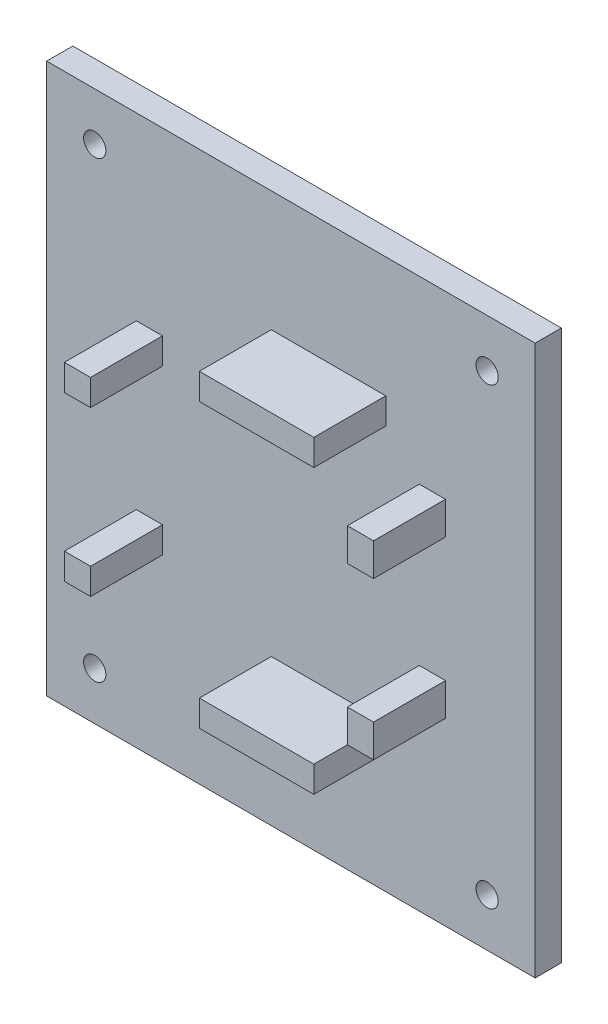
ISO-10303-21;
HEADER;
FILE_DESCRIPTION(('STEP AP214'),'2;1');
FILE_NAME('part.step','',(''),(''),'','','');
FILE_SCHEMA(('AUTOMOTIVE_DESIGN { 1 0 10303 214 1 1 1 1 }'));
ENDSEC;
DATA;
#1=APPLICATION_CONTEXT('core data for automotive mechanical design processes');
#2=APPLICATION_PROTOCOL_DEFINITION('international standard','automotive_design',2000,#1);
#3=PRODUCT_CONTEXT('',#1,'mechanical');
#4=PRODUCT('Part','Part','',(#3));
#5=PRODUCT_RELATED_PRODUCT_CATEGORY('part','',(#4));
#6=PRODUCT_DEFINITION_FORMATION('','',#4);
#7=PRODUCT_DEFINITION_CONTEXT('part definition',#1,'design');
#8=PRODUCT_DEFINITION('design','',#6,#7);
#9=PRODUCT_DEFINITION_SHAPE('','',#8);
#10=(LENGTH_UNIT() NAMED_UNIT(*) SI_UNIT(.MILLI.,.METRE.));
#11=(NAMED_UNIT(*) PLANE_ANGLE_UNIT() SI_UNIT($,.RADIAN.));
#12=(NAMED_UNIT(*) SI_UNIT($,.STERADIAN.) SOLID_ANGLE_UNIT());
#13=UNCERTAINTY_MEASURE_WITH_UNIT(LENGTH_MEASURE(1.E-05),#10,'distance_accuracy_value','');
#14=(GEOMETRIC_REPRESENTATION_CONTEXT(3) GLOBAL_UNCERTAINTY_ASSIGNED_CONTEXT((#13)) GLOBAL_UNIT_ASSIGNED_CONTEXT((#10,
#11,#12)) REPRESENTATION_CONTEXT('',''));
#15=CARTESIAN_POINT('',(0.,0.,0.));
#16=DIRECTION('',(0.,0.,1.));
#17=DIRECTION('',(1.,0.,0.));
#18=AXIS2_PLACEMENT_3D('',#15,#16,#17);
#19=CARTESIAN_POINT('',(0.,0.,4.));
#20=DIRECTION('',(0.,0.,1.));
#21=DIRECTION('',(1.,0.,0.));
#22=AXIS2_PLACEMENT_3D('',#19,#20,#21);
#23=PLANE('',#22);
#24=DIRECTION('',(0.,-1.,0.));
#25=VECTOR('',#24,1.);
#26=CARTESIAN_POINT('',(-23.63,0.,4.));
#27=LINE('',#26,#25);
#28=CARTESIAN_POINT('',(-23.63,-10.5,4.));
#29=VERTEX_POINT('',#28);
#30=CARTESIAN_POINT('',(-23.63,-14.5,4.));
#31=VERTEX_POINT('',#30);
#32=EDGE_CURVE('E396',#29,#31,#27,.T.);
#33=ORIENTED_EDGE('',*,*,#32,.F.);
#34=DIRECTION('',(1.,0.,0.));
#35=VECTOR('',#34,1.);
#36=CARTESIAN_POINT('',(0.,-10.5,4.));
#37=LINE('',#36,#35);
#38=CARTESIAN_POINT('',(-19.63,-10.5,4.));
#39=VERTEX_POINT('',#38);
#40=EDGE_CURVE('E394',#29,#39,#37,.T.);
#41=ORIENTED_EDGE('',*,*,#40,.T.);
#42=DIRECTION('',(0.,1.,0.));
#43=VECTOR('',#42,1.);
#44=CARTESIAN_POINT('',(-19.63,0.,4.));
#45=LINE('',#44,#43);
#46=CARTESIAN_POINT('',(-19.63,-14.5,4.));
#47=VERTEX_POINT('',#46);
#48=EDGE_CURVE('E393',#47,#39,#45,.T.);
#49=ORIENTED_EDGE('',*,*,#48,.F.);
#50=DIRECTION('',(1.,0.,0.));
#51=VECTOR('',#50,1.);
#52=CARTESIAN_POINT('',(0.,-14.5,4.));
#53=LINE('',#52,#51);
#54=EDGE_CURVE('E398',#31,#47,#53,.T.);
#55=ORIENTED_EDGE('',*,*,#54,.F.);
#56=EDGE_LOOP('',(#33,#41,#49,#55));
#57=FACE_BOUND('',#56,.T.);
#58=DIRECTION('',(0.,-1.,0.));
#59=VECTOR('',#58,1.);
#60=CARTESIAN_POINT('',(-2.99999999999999,0.,4.));
#61=LINE('',#60,#59);
#62=CARTESIAN_POINT('',(-3.,23.63,4.));
#63=VERTEX_POINT('',#62);
#64=CARTESIAN_POINT('',(-3.,19.63,4.));
#65=VERTEX_POINT('',#64);
#66=EDGE_CURVE('E388',#63,#65,#61,.T.);
#67=ORIENTED_EDGE('',*,*,#66,.F.);
#68=DIRECTION('',(1.,0.,0.));
#69=VECTOR('',#68,1.);
#70=CARTESIAN_POINT('',(0.,23.63,4.));
#71=LINE('',#70,#69);
#72=CARTESIAN_POINT('',(14.5,23.63,4.));
#73=VERTEX_POINT('',#72);
#74=EDGE_CURVE('E385',#63,#73,#71,.T.);
#75=ORIENTED_EDGE('',*,*,#74,.T.);
#76=DIRECTION('',(0.,-1.,0.));
#77=VECTOR('',#76,1.);
#78=CARTESIAN_POINT('',(14.5,0.,4.));
#79=LINE('',#78,#77);
#80=CARTESIAN_POINT('',(14.5,19.63,4.));
#81=VERTEX_POINT('',#80);
#82=EDGE_CURVE('E384',#73,#81,#79,.T.);
#83=ORIENTED_EDGE('',*,*,#82,.T.);
#84=DIRECTION('',(1.,0.,0.));
#85=VECTOR('',#84,1.);
#86=CARTESIAN_POINT('',(0.,19.63,4.));
#87=LINE('',#86,#85);
#88=EDGE_CURVE('E389',#65,#81,#87,.T.);
#89=ORIENTED_EDGE('',*,*,#88,.F.);
#90=EDGE_LOOP('',(#67,#75,#83,#89));
#91=FACE_BOUND('',#90,.T.);
#92=DIRECTION('',(0.,1.,0.));
#93=VECTOR('',#92,1.);
#94=CARTESIAN_POINT('',(-19.63,0.,4.));
#95=LINE('',#94,#93);
#96=CARTESIAN_POINT('',(-19.63,10.5,4.));
#97=VERTEX_POINT('',#96);
#98=CARTESIAN_POINT('',(-19.63,14.5,4.));
#99=VERTEX_POINT('',#98);
#100=EDGE_CURVE('E369',#97,#99,#95,.T.);
#101=ORIENTED_EDGE('',*,*,#100,.F.);
#102=DIRECTION('',(1.,0.,0.));
#103=VECTOR('',#102,1.);
#104=CARTESIAN_POINT('',(0.,10.5,4.));
#105=LINE('',#104,#103);
#106=CARTESIAN_POINT('',(-23.63,10.5,4.));
#107=VERTEX_POINT('',#106);
#108=EDGE_CURVE('E250',#107,#97,#105,.T.);
#109=ORIENTED_EDGE('',*,*,#108,.F.);
#110=DIRECTION('',(0.,1.,0.));
#111=VECTOR('',#110,1.);
#112=CARTESIAN_POINT('',(-23.63,0.,4.));
#113=LINE('',#112,#111);
#114=CARTESIAN_POINT('',(-23.63,14.5,4.));
#115=VERTEX_POINT('',#114);
#116=EDGE_CURVE('E246',#107,#115,#113,.T.);
#117=ORIENTED_EDGE('',*,*,#116,.T.);
#118=DIRECTION('',(1.,0.,0.));
#119=VECTOR('',#118,1.);
#120=CARTESIAN_POINT('',(0.,14.5,4.));
#121=LINE('',#120,#119);
#122=EDGE_CURVE('E370',#115,#99,#121,.T.);
#123=ORIENTED_EDGE('',*,*,#122,.T.);
#124=EDGE_LOOP('',(#101,#109,#117,#123));
#125=FACE_BOUND('',#124,.T.);
#126=CARTESIAN_POINT('',(-29.99,-34.68,4.));
#127=DIRECTION('',(0.,0.,1.));
#128=DIRECTION('',(1.,0.,0.));
#129=AXIS2_PLACEMENT_3D('',#126,#127,#128);
#130=CIRCLE('',#129,1.7);
#131=CARTESIAN_POINT('',(-28.29,-34.68,4.));
#132=VERTEX_POINT('',#131);
#133=EDGE_CURVE('E420',#132,#132,#130,.T.);
#134=ORIENTED_EDGE('',*,*,#133,.F.);
#135=EDGE_LOOP('',(#134));
#136=FACE_BOUND('',#135,.T.);
#137=CARTESIAN_POINT('',(29.99,-34.68,4.));
#138=DIRECTION('',(0.,0.,1.));
#139=DIRECTION('',(1.,0.,0.));
#140=AXIS2_PLACEMENT_3D('',#137,#138,#139);
#141=CIRCLE('',#140,1.7);
#142=CARTESIAN_POINT('',(31.69,-34.68,4.));
#143=VERTEX_POINT('',#142);
#144=EDGE_CURVE('E425',#143,#143,#141,.T.);
#145=ORIENTED_EDGE('',*,*,#144,.F.);
#146=EDGE_LOOP('',(#145));
#147=FACE_BOUND('',#146,.T.);
#148=CARTESIAN_POINT('',(-29.99,34.68,4.));
#149=DIRECTION('',(0.,0.,1.));
#150=DIRECTION('',(1.,0.,0.));
#151=AXIS2_PLACEMENT_3D('',#148,#149,#150);
#152=CIRCLE('',#151,1.7);
#153=CARTESIAN_POINT('',(-28.29,34.68,4.));
#154=VERTEX_POINT('',#153);
#155=EDGE_CURVE('E426',#154,#154,#152,.T.);
#156=ORIENTED_EDGE('',*,*,#155,.F.);
#157=EDGE_LOOP('',(#156));
#158=FACE_BOUND('',#157,.T.);
#159=DIRECTION('',(0.,-1.,0.));
#160=VECTOR('',#159,1.);
#161=CARTESIAN_POINT('',(37.335,0.,4.));
#162=LINE('',#161,#160);
#163=CARTESIAN_POINT('',(37.335,42.025,4.));
#164=VERTEX_POINT('',#163);
#165=CARTESIAN_POINT('',(37.335,-42.025,4.));
#166=VERTEX_POINT('',#165);
#167=EDGE_CURVE('E427',#164,#166,#162,.T.);
#168=ORIENTED_EDGE('',*,*,#167,.F.);
#169=DIRECTION('',(1.,0.,0.));
#170=VECTOR('',#169,1.);
#171=CARTESIAN_POINT('',(0.,42.025,4.));
#172=LINE('',#171,#170);
#173=CARTESIAN_POINT('',(-37.335,42.025,4.));
#174=VERTEX_POINT('',#173);
#175=EDGE_CURVE('E435',#174,#164,#172,.T.);
#176=ORIENTED_EDGE('',*,*,#175,.F.);
#177=DIRECTION('',(0.,-1.,0.));
#178=VECTOR('',#177,1.);
#179=CARTESIAN_POINT('',(-37.335,0.,4.));
#180=LINE('',#179,#178);
#181=CARTESIAN_POINT('',(-37.335,-42.025,4.));
#182=VERTEX_POINT('',#181);
#183=EDGE_CURVE('E434',#174,#182,#180,.T.);
#184=ORIENTED_EDGE('',*,*,#183,.T.);
#185=DIRECTION('',(1.,0.,0.));
#186=VECTOR('',#185,1.);
#187=CARTESIAN_POINT('',(0.,-42.025,4.));
#188=LINE('',#187,#186);
#189=EDGE_CURVE('E437',#182,#166,#188,.T.);
#190=ORIENTED_EDGE('',*,*,#189,.T.);
#191=EDGE_LOOP('',(#168,#176,#184,#190));
#192=FACE_BOUND('',#191,.T.);
#193=CARTESIAN_POINT('',(29.99,34.68,4.));
#194=DIRECTION('',(0.,0.,1.));
#195=DIRECTION('',(1.,0.,0.));
#196=AXIS2_PLACEMENT_3D('',#193,#194,#195);
#197=CIRCLE('',#196,1.7);
#198=CARTESIAN_POINT('',(31.69,34.68,4.));
#199=VERTEX_POINT('',#198);
#200=EDGE_CURVE('E439',#199,#199,#197,.T.);
#201=ORIENTED_EDGE('',*,*,#200,.F.);
#202=EDGE_LOOP('',(#201));
#203=FACE_BOUND('',#202,.T.);
#204=DIRECTION('',(0.,-1.,0.));
#205=VECTOR('',#204,1.);
#206=CARTESIAN_POINT('',(23.63,0.,4.));
#207=LINE('',#206,#205);
#208=CARTESIAN_POINT('',(23.63,-9.5,4.));
#209=VERTEX_POINT('',#208);
#210=CARTESIAN_POINT('',(23.63,-14.5,4.));
#211=VERTEX_POINT('',#210);
#212=EDGE_CURVE('E378',#209,#211,#207,.T.);
#213=ORIENTED_EDGE('',*,*,#212,.T.);
#214=DIRECTION('',(-1.,0.,0.));
#215=VECTOR('',#214,1.);
#216=CARTESIAN_POINT('',(0.,-14.5,4.));
#217=LINE('',#216,#215);
#218=CARTESIAN_POINT('',(19.63,-14.5,4.));
#219=VERTEX_POINT('',#218);
#220=EDGE_CURVE('E379',#211,#219,#217,.T.);
#221=ORIENTED_EDGE('',*,*,#220,.T.);
#222=DIRECTION('',(0.,-1.,0.));
#223=VECTOR('',#222,1.);
#224=CARTESIAN_POINT('',(19.63,0.,4.));
#225=LINE('',#224,#223);
#226=CARTESIAN_POINT('',(19.63,-9.5,4.));
#227=VERTEX_POINT('',#226);
#228=EDGE_CURVE('E375',#227,#219,#225,.T.);
#229=ORIENTED_EDGE('',*,*,#228,.F.);
#230=DIRECTION('',(-1.,0.,0.));
#231=VECTOR('',#230,1.);
#232=CARTESIAN_POINT('',(0.,-9.5,4.));
#233=LINE('',#232,#231);
#234=EDGE_CURVE('E374',#209,#227,#233,.T.);
#235=ORIENTED_EDGE('',*,*,#234,.F.);
#236=EDGE_LOOP('',(#213,#221,#229,#235));
#237=FACE_BOUND('',#236,.T.);
#238=DIRECTION('',(-1.,0.,0.));
#239=VECTOR('',#238,1.);
#240=CARTESIAN_POINT('',(0.,9.50000000000004,4.));
#241=LINE('',#240,#239);
#242=CARTESIAN_POINT('',(23.63,9.50000000000001,4.));
#243=VERTEX_POINT('',#242);
#244=CARTESIAN_POINT('',(19.63,9.50000000000001,4.));
#245=VERTEX_POINT('',#244);
#246=EDGE_CURVE('E410',#243,#245,#241,.T.);
#247=ORIENTED_EDGE('',*,*,#246,.T.);
#248=DIRECTION('',(0.,1.,0.));
#249=VECTOR('',#248,1.);
#250=CARTESIAN_POINT('',(19.63,0.,4.));
#251=LINE('',#250,#249);
#252=CARTESIAN_POINT('',(19.63,14.5,4.));
#253=VERTEX_POINT('',#252);
#254=EDGE_CURVE('E408',#245,#253,#251,.T.);
#255=ORIENTED_EDGE('',*,*,#254,.T.);
#256=DIRECTION('',(-1.,0.,0.));
#257=VECTOR('',#256,1.);
#258=CARTESIAN_POINT('',(0.,14.5,4.));
#259=LINE('',#258,#257);
#260=CARTESIAN_POINT('',(23.63,14.5,4.));
#261=VERTEX_POINT('',#260);
#262=EDGE_CURVE('E405',#261,#253,#259,.T.);
#263=ORIENTED_EDGE('',*,*,#262,.F.);
#264=DIRECTION('',(0.,1.,0.));
#265=VECTOR('',#264,1.);
#266=CARTESIAN_POINT('',(23.63,0.,4.));
#267=LINE('',#266,#265);
#268=EDGE_CURVE('E403',#243,#261,#267,.T.);
#269=ORIENTED_EDGE('',*,*,#268,.F.);
#270=EDGE_LOOP('',(#247,#255,#263,#269));
#271=FACE_BOUND('',#270,.T.);
#272=DIRECTION('',(0.,1.,0.));
#273=VECTOR('',#272,1.);
#274=CARTESIAN_POINT('',(-2.99999999999999,0.,4.));
#275=LINE('',#274,#273);
#276=CARTESIAN_POINT('',(-3.,-23.63,4.));
#277=VERTEX_POINT('',#276);
#278=CARTESIAN_POINT('',(-3.,-19.63,4.));
#279=VERTEX_POINT('',#278);
#280=EDGE_CURVE('E57',#277,#279,#275,.T.);
#281=ORIENTED_EDGE('',*,*,#280,.T.);
#282=DIRECTION('',(1.,0.,0.));
#283=VECTOR('',#282,1.);
#284=CARTESIAN_POINT('',(0.,-19.63,4.));
#285=LINE('',#284,#283);
#286=CARTESIAN_POINT('',(14.5,-19.63,4.));
#287=VERTEX_POINT('',#286);
#288=EDGE_CURVE('E247',#279,#287,#285,.T.);
#289=ORIENTED_EDGE('',*,*,#288,.T.);
#290=DIRECTION('',(0.,1.,0.));
#291=VECTOR('',#290,1.);
#292=CARTESIAN_POINT('',(14.5,0.,4.));
#293=LINE('',#292,#291);
#294=CARTESIAN_POINT('',(14.5,-23.63,4.));
#295=VERTEX_POINT('',#294);
#296=EDGE_CURVE('E415',#295,#287,#293,.T.);
#297=ORIENTED_EDGE('',*,*,#296,.F.);
#298=DIRECTION('',(1.,0.,0.));
#299=VECTOR('',#298,1.);
#300=CARTESIAN_POINT('',(0.,-23.63,4.));
#301=LINE('',#300,#299);
#302=EDGE_CURVE('E62',#277,#295,#301,.T.);
#303=ORIENTED_EDGE('',*,*,#302,.F.);
#304=EDGE_LOOP('',(#281,#289,#297,#303));
#305=FACE_BOUND('',#304,.T.);
#306=ADVANCED_FACE('F41',(#57,#91,#125,#136,#147,#158,#192,#203,#237,#271,#305),#23,.T.);
#307=CARTESIAN_POINT('',(37.335,0.,4.));
#308=DIRECTION('',(1.,0.,0.));
#309=DIRECTION('',(0.,0.,-1.));
#310=AXIS2_PLACEMENT_3D('',#307,#308,#309);
#311=PLANE('',#310);
#312=DIRECTION('',(0.,-1.,0.));
#313=VECTOR('',#312,1.);
#314=CARTESIAN_POINT('',(37.335,0.,0.));
#315=LINE('',#314,#313);
#316=CARTESIAN_POINT('',(37.335,42.025,0.));
#317=VERTEX_POINT('',#316);
#318=CARTESIAN_POINT('',(37.335,-42.025,0.));
#319=VERTEX_POINT('',#318);
#320=EDGE_CURVE('E455',#317,#319,#315,.T.);
#321=ORIENTED_EDGE('',*,*,#320,.F.);
#322=DIRECTION('',(0.,0.,-1.));
#323=VECTOR('',#322,1.);
#324=CARTESIAN_POINT('',(37.335,42.025,4.));
#325=LINE('',#324,#323);
#326=EDGE_CURVE('E11',#164,#317,#325,.T.);
#327=ORIENTED_EDGE('',*,*,#326,.F.);
#328=ORIENTED_EDGE('',*,*,#167,.T.);
#329=DIRECTION('',(0.,0.,-1.));
#330=VECTOR('',#329,1.);
#331=CARTESIAN_POINT('',(37.335,-42.025,4.));
#332=LINE('',#331,#330);
#333=EDGE_CURVE('E444',#166,#319,#332,.T.);
#334=ORIENTED_EDGE('',*,*,#333,.T.);
#335=EDGE_LOOP('',(#321,#327,#328,#334));
#336=FACE_BOUND('',#335,.T.);
#337=ADVANCED_FACE('F482',(#336),#311,.T.);
#338=CARTESIAN_POINT('',(0.,42.025,4.));
#339=DIRECTION('',(0.,1.,0.));
#340=DIRECTION('',(0.,0.,1.));
#341=AXIS2_PLACEMENT_3D('',#338,#339,#340);
#342=PLANE('',#341);
#343=DIRECTION('',(1.,0.,0.));
#344=VECTOR('',#343,1.);
#345=CARTESIAN_POINT('',(0.,42.025,0.));
#346=LINE('',#345,#344);
#347=CARTESIAN_POINT('',(-37.335,42.025,0.));
#348=VERTEX_POINT('',#347);
#349=EDGE_CURVE('E451',#348,#317,#346,.T.);
#350=ORIENTED_EDGE('',*,*,#349,.F.);
#351=DIRECTION('',(0.,0.,-1.));
#352=VECTOR('',#351,1.);
#353=CARTESIAN_POINT('',(-37.335,42.025,4.));
#354=LINE('',#353,#352);
#355=EDGE_CURVE('E47',#174,#348,#354,.T.);
#356=ORIENTED_EDGE('',*,*,#355,.F.);
#357=ORIENTED_EDGE('',*,*,#175,.T.);
#358=ORIENTED_EDGE('',*,*,#326,.T.);
#359=EDGE_LOOP('',(#350,#356,#357,#358));
#360=FACE_BOUND('',#359,.T.);
#361=ADVANCED_FACE('F477',(#360),#342,.T.);
#362=CARTESIAN_POINT('',(-37.335,0.,4.));
#363=DIRECTION('',(1.,0.,0.));
#364=DIRECTION('',(0.,0.,-1.));
#365=AXIS2_PLACEMENT_3D('',#362,#363,#364);
#366=PLANE('',#365);
#367=DIRECTION('',(0.,-1.,0.));
#368=VECTOR('',#367,1.);
#369=CARTESIAN_POINT('',(-37.335,0.,0.));
#370=LINE('',#369,#368);
#371=CARTESIAN_POINT('',(-37.335,-42.025,0.));
#372=VERTEX_POINT('',#371);
#373=EDGE_CURVE('E456',#348,#372,#370,.T.);
#374=ORIENTED_EDGE('',*,*,#373,.T.);
#375=DIRECTION('',(0.,0.,-1.));
#376=VECTOR('',#375,1.);
#377=CARTESIAN_POINT('',(-37.335,-42.025,4.));
#378=LINE('',#377,#376);
#379=EDGE_CURVE('E470',#182,#372,#378,.T.);
#380=ORIENTED_EDGE('',*,*,#379,.F.);
#381=ORIENTED_EDGE('',*,*,#183,.F.);
#382=ORIENTED_EDGE('',*,*,#355,.T.);
#383=EDGE_LOOP('',(#374,#380,#381,#382));
#384=FACE_BOUND('',#383,.T.);
#385=ADVANCED_FACE('F472',(#384),#366,.F.);
#386=CARTESIAN_POINT('',(0.,-42.025,4.));
#387=DIRECTION('',(0.,1.,0.));
#388=DIRECTION('',(0.,0.,1.));
#389=AXIS2_PLACEMENT_3D('',#386,#387,#388);
#390=PLANE('',#389);
#391=DIRECTION('',(1.,0.,0.));
#392=VECTOR('',#391,1.);
#393=CARTESIAN_POINT('',(0.,-42.025,0.));
#394=LINE('',#393,#392);
#395=EDGE_CURVE('E462',#372,#319,#394,.T.);
#396=ORIENTED_EDGE('',*,*,#395,.T.);
#397=ORIENTED_EDGE('',*,*,#333,.F.);
#398=ORIENTED_EDGE('',*,*,#189,.F.);
#399=ORIENTED_EDGE('',*,*,#379,.T.);
#400=EDGE_LOOP('',(#396,#397,#398,#399));
#401=FACE_BOUND('',#400,.T.);
#402=ADVANCED_FACE('F490',(#401),#390,.F.);
#403=CARTESIAN_POINT('',(-29.99,34.68,4.));
#404=DIRECTION('',(0.,0.,-1.));
#405=DIRECTION('',(-1.,0.,0.));
#406=AXIS2_PLACEMENT_3D('',#403,#404,#405);
#407=CYLINDRICAL_SURFACE('',#406,1.7);
#408=ORIENTED_EDGE('',*,*,#155,.T.);
#409=EDGE_LOOP('',(#408));
#410=FACE_BOUND('',#409,.T.);
#411=CARTESIAN_POINT('',(-29.99,34.68,0.));
#412=DIRECTION('',(0.,0.,1.));
#413=DIRECTION('',(1.,0.,0.));
#414=AXIS2_PLACEMENT_3D('',#411,#412,#413);
#415=CIRCLE('',#414,1.7);
#416=CARTESIAN_POINT('',(-28.29,34.68,0.));
#417=VERTEX_POINT('',#416);
#418=EDGE_CURVE('E446',#417,#417,#415,.T.);
#419=ORIENTED_EDGE('',*,*,#418,.F.);
#420=EDGE_LOOP('',(#419));
#421=FACE_BOUND('',#420,.T.);
#422=ADVANCED_FACE('F617',(#410,#421),#407,.F.);
#423=CARTESIAN_POINT('',(29.99,-34.68,4.));
#424=DIRECTION('',(0.,0.,-1.));
#425=DIRECTION('',(-1.,0.,0.));
#426=AXIS2_PLACEMENT_3D('',#423,#424,#425);
#427=CYLINDRICAL_SURFACE('',#426,1.7);
#428=ORIENTED_EDGE('',*,*,#144,.T.);
#429=EDGE_LOOP('',(#428));
#430=FACE_BOUND('',#429,.T.);
#431=CARTESIAN_POINT('',(29.99,-34.68,0.));
#432=DIRECTION('',(0.,0.,1.));
#433=DIRECTION('',(1.,0.,0.));
#434=AXIS2_PLACEMENT_3D('',#431,#432,#433);
#435=CIRCLE('',#434,1.7);
#436=CARTESIAN_POINT('',(31.69,-34.68,0.));
#437=VERTEX_POINT('',#436);
#438=EDGE_CURVE('E447',#437,#437,#435,.T.);
#439=ORIENTED_EDGE('',*,*,#438,.F.);
#440=EDGE_LOOP('',(#439));
#441=FACE_BOUND('',#440,.T.);
#442=ADVANCED_FACE('F624',(#430,#441),#427,.F.);
#443=CARTESIAN_POINT('',(-29.99,-34.68,4.));
#444=DIRECTION('',(0.,0.,-1.));
#445=DIRECTION('',(-1.,0.,0.));
#446=AXIS2_PLACEMENT_3D('',#443,#444,#445);
#447=CYLINDRICAL_SURFACE('',#446,1.7);
#448=ORIENTED_EDGE('',*,*,#133,.T.);
#449=EDGE_LOOP('',(#448));
#450=FACE_BOUND('',#449,.T.);
#451=CARTESIAN_POINT('',(-29.99,-34.68,0.));
#452=DIRECTION('',(0.,0.,1.));
#453=DIRECTION('',(1.,0.,0.));
#454=AXIS2_PLACEMENT_3D('',#451,#452,#453);
#455=CIRCLE('',#454,1.7);
#456=CARTESIAN_POINT('',(-28.29,-34.68,0.));
#457=VERTEX_POINT('',#456);
#458=EDGE_CURVE('E416',#457,#457,#455,.T.);
#459=ORIENTED_EDGE('',*,*,#458,.F.);
#460=EDGE_LOOP('',(#459));
#461=FACE_BOUND('',#460,.T.);
#462=ADVANCED_FACE('F43',(#450,#461),#447,.F.);
#463=CARTESIAN_POINT('',(29.99,34.68,4.));
#464=DIRECTION('',(0.,0.,-1.));
#465=DIRECTION('',(-1.,0.,0.));
#466=AXIS2_PLACEMENT_3D('',#463,#464,#465);
#467=CYLINDRICAL_SURFACE('',#466,1.7);
#468=ORIENTED_EDGE('',*,*,#200,.T.);
#469=EDGE_LOOP('',(#468));
#470=FACE_BOUND('',#469,.T.);
#471=CARTESIAN_POINT('',(29.99,34.68,0.));
#472=DIRECTION('',(0.,0.,1.));
#473=DIRECTION('',(1.,0.,0.));
#474=AXIS2_PLACEMENT_3D('',#471,#472,#473);
#475=CIRCLE('',#474,1.7);
#476=CARTESIAN_POINT('',(31.69,34.68,0.));
#477=VERTEX_POINT('',#476);
#478=EDGE_CURVE('E421',#477,#477,#475,.T.);
#479=ORIENTED_EDGE('',*,*,#478,.F.);
#480=EDGE_LOOP('',(#479));
#481=FACE_BOUND('',#480,.T.);
#482=ADVANCED_FACE('F606',(#470,#481),#467,.F.);
#483=CARTESIAN_POINT('',(0.,0.,0.));
#484=DIRECTION('',(0.,0.,1.));
#485=DIRECTION('',(1.,0.,0.));
#486=AXIS2_PLACEMENT_3D('',#483,#484,#485);
#487=PLANE('',#486);
#488=ORIENTED_EDGE('',*,*,#478,.T.);
#489=EDGE_LOOP('',(#488));
#490=FACE_BOUND('',#489,.T.);
#491=ORIENTED_EDGE('',*,*,#320,.T.);
#492=ORIENTED_EDGE('',*,*,#395,.F.);
#493=ORIENTED_EDGE('',*,*,#373,.F.);
#494=ORIENTED_EDGE('',*,*,#349,.T.);
#495=EDGE_LOOP('',(#491,#492,#493,#494));
#496=FACE_BOUND('',#495,.T.);
#497=ORIENTED_EDGE('',*,*,#418,.T.);
#498=EDGE_LOOP('',(#497));
#499=FACE_BOUND('',#498,.T.);
#500=ORIENTED_EDGE('',*,*,#438,.T.);
#501=EDGE_LOOP('',(#500));
#502=FACE_BOUND('',#501,.T.);
#503=ORIENTED_EDGE('',*,*,#458,.T.);
#504=EDGE_LOOP('',(#503));
#505=FACE_BOUND('',#504,.T.);
#506=ADVANCED_FACE('F476',(#490,#496,#499,#502,#505),#487,.F.);
#507=CARTESIAN_POINT('',(-19.63,14.5,15.));
#508=DIRECTION('',(1.,0.,0.));
#509=DIRECTION('',(0.,0.,-1.));
#510=AXIS2_PLACEMENT_3D('',#507,#508,#509);
#511=PLANE('',#510);
#512=DIRECTION('',(0.,0.,-1.));
#513=VECTOR('',#512,1.);
#514=CARTESIAN_POINT('',(-19.63,10.5,15.));
#515=LINE('',#514,#513);
#516=CARTESIAN_POINT('',(-19.63,10.5,15.));
#517=VERTEX_POINT('',#516);
#518=EDGE_CURVE('E301',#517,#97,#515,.T.);
#519=ORIENTED_EDGE('',*,*,#518,.T.);
#520=ORIENTED_EDGE('',*,*,#100,.T.);
#521=DIRECTION('',(0.,0.,-1.));
#522=VECTOR('',#521,1.);
#523=CARTESIAN_POINT('',(-19.63,14.5,15.));
#524=LINE('',#523,#522);
#525=CARTESIAN_POINT('',(-19.63,14.5,15.));
#526=VERTEX_POINT('',#525);
#527=EDGE_CURVE('E276',#526,#99,#524,.T.);
#528=ORIENTED_EDGE('',*,*,#527,.F.);
#529=DIRECTION('',(0.,-1.,0.));
#530=VECTOR('',#529,1.);
#531=CARTESIAN_POINT('',(-19.63,14.5,15.));
#532=LINE('',#531,#530);
#533=EDGE_CURVE('E281',#526,#517,#532,.T.);
#534=ORIENTED_EDGE('',*,*,#533,.T.);
#535=EDGE_LOOP('',(#519,#520,#528,#534));
#536=FACE_BOUND('',#535,.T.);
#537=ADVANCED_FACE('F548',(#536),#511,.T.);
#538=CARTESIAN_POINT('',(-19.63,14.5,15.));
#539=DIRECTION('',(0.,-1.,0.));
#540=DIRECTION('',(1.,0.,0.));
#541=AXIS2_PLACEMENT_3D('',#538,#539,#540);
#542=PLANE('',#541);
#543=ORIENTED_EDGE('',*,*,#122,.F.);
#544=DIRECTION('',(0.,0.,-1.));
#545=VECTOR('',#544,1.);
#546=CARTESIAN_POINT('',(-23.63,14.5,15.));
#547=LINE('',#546,#545);
#548=CARTESIAN_POINT('',(-23.63,14.5,15.));
#549=VERTEX_POINT('',#548);
#550=EDGE_CURVE('E315',#549,#115,#547,.T.);
#551=ORIENTED_EDGE('',*,*,#550,.F.);
#552=DIRECTION('',(-1.,0.,0.));
#553=VECTOR('',#552,1.);
#554=CARTESIAN_POINT('',(-19.63,14.5,15.));
#555=LINE('',#554,#553);
#556=EDGE_CURVE('E306',#526,#549,#555,.T.);
#557=ORIENTED_EDGE('',*,*,#556,.F.);
#558=ORIENTED_EDGE('',*,*,#527,.T.);
#559=EDGE_LOOP('',(#543,#551,#557,#558));
#560=FACE_BOUND('',#559,.T.);
#561=ADVANCED_FACE('F555',(#560),#542,.F.);
#562=CARTESIAN_POINT('',(-23.63,14.5,15.));
#563=DIRECTION('',(1.,0.,0.));
#564=DIRECTION('',(0.,0.,-1.));
#565=AXIS2_PLACEMENT_3D('',#562,#563,#564);
#566=PLANE('',#565);
#567=ORIENTED_EDGE('',*,*,#116,.F.);
#568=DIRECTION('',(0.,0.,-1.));
#569=VECTOR('',#568,1.);
#570=CARTESIAN_POINT('',(-23.63,10.5,15.));
#571=LINE('',#570,#569);
#572=CARTESIAN_POINT('',(-23.63,10.5,15.));
#573=VERTEX_POINT('',#572);
#574=EDGE_CURVE('E310',#573,#107,#571,.T.);
#575=ORIENTED_EDGE('',*,*,#574,.F.);
#576=DIRECTION('',(0.,-1.,0.));
#577=VECTOR('',#576,1.);
#578=CARTESIAN_POINT('',(-23.63,14.5,15.));
#579=LINE('',#578,#577);
#580=EDGE_CURVE('E318',#549,#573,#579,.T.);
#581=ORIENTED_EDGE('',*,*,#580,.F.);
#582=ORIENTED_EDGE('',*,*,#550,.T.);
#583=EDGE_LOOP('',(#567,#575,#581,#582));
#584=FACE_BOUND('',#583,.T.);
#585=ADVANCED_FACE('F559',(#584),#566,.F.);
#586=CARTESIAN_POINT('',(-19.63,10.5,15.));
#587=DIRECTION('',(0.,-1.,0.));
#588=DIRECTION('',(1.,0.,0.));
#589=AXIS2_PLACEMENT_3D('',#586,#587,#588);
#590=PLANE('',#589);
#591=ORIENTED_EDGE('',*,*,#574,.T.);
#592=ORIENTED_EDGE('',*,*,#108,.T.);
#593=ORIENTED_EDGE('',*,*,#518,.F.);
#594=DIRECTION('',(-1.,0.,0.));
#595=VECTOR('',#594,1.);
#596=CARTESIAN_POINT('',(-19.63,10.5,15.));
#597=LINE('',#596,#595);
#598=EDGE_CURVE('E319',#517,#573,#597,.T.);
#599=ORIENTED_EDGE('',*,*,#598,.T.);
#600=EDGE_LOOP('',(#591,#592,#593,#599));
#601=FACE_BOUND('',#600,.T.);
#602=ADVANCED_FACE('F551',(#601),#590,.T.);
#603=CARTESIAN_POINT('',(0.,0.,15.));
#604=DIRECTION('',(0.,0.,-1.));
#605=DIRECTION('',(-1.,0.,0.));
#606=AXIS2_PLACEMENT_3D('',#603,#604,#605);
#607=PLANE('',#606);
#608=ORIENTED_EDGE('',*,*,#533,.F.);
#609=ORIENTED_EDGE('',*,*,#556,.T.);
#610=ORIENTED_EDGE('',*,*,#580,.T.);
#611=ORIENTED_EDGE('',*,*,#598,.F.);
#612=EDGE_LOOP('',(#608,#609,#610,#611));
#613=FACE_BOUND('',#612,.T.);
#614=ADVANCED_FACE('F533',(#613),#607,.F.);
#615=CARTESIAN_POINT('',(0.,-14.5,15.));
#616=DIRECTION('',(0.,1.,0.));
#617=DIRECTION('',(0.,0.,1.));
#618=AXIS2_PLACEMENT_3D('',#615,#616,#617);
#619=PLANE('',#618);
#620=ORIENTED_EDGE('',*,*,#220,.F.);
#621=DIRECTION('',(0.,0.,-1.));
#622=VECTOR('',#621,1.);
#623=CARTESIAN_POINT('',(23.63,-14.5,15.));
#624=LINE('',#623,#622);
#625=CARTESIAN_POINT('',(23.63,-14.5,15.));
#626=VERTEX_POINT('',#625);
#627=EDGE_CURVE('E278',#626,#211,#624,.T.);
#628=ORIENTED_EDGE('',*,*,#627,.F.);
#629=DIRECTION('',(1.,0.,0.));
#630=VECTOR('',#629,1.);
#631=CARTESIAN_POINT('',(0.,-14.5,15.));
#632=LINE('',#631,#630);
#633=CARTESIAN_POINT('',(19.63,-14.5,15.));
#634=VERTEX_POINT('',#633);
#635=EDGE_CURVE('E302',#634,#626,#632,.T.);
#636=ORIENTED_EDGE('',*,*,#635,.F.);
#637=DIRECTION('',(0.,0.,-1.));
#638=VECTOR('',#637,1.);
#639=CARTESIAN_POINT('',(19.63,-14.5,15.));
#640=LINE('',#639,#638);
#641=EDGE_CURVE('E286',#634,#219,#640,.T.);
#642=ORIENTED_EDGE('',*,*,#641,.T.);
#643=EDGE_LOOP('',(#620,#628,#636,#642));
#644=FACE_BOUND('',#643,.T.);
#645=ADVANCED_FACE('F527',(#644),#619,.F.);
#646=CARTESIAN_POINT('',(23.63,0.,15.));
#647=DIRECTION('',(-1.,0.,0.));
#648=DIRECTION('',(0.,-1.,0.));
#649=AXIS2_PLACEMENT_3D('',#646,#647,#648);
#650=PLANE('',#649);
#651=ORIENTED_EDGE('',*,*,#212,.F.);
#652=DIRECTION('',(0.,0.,-1.));
#653=VECTOR('',#652,1.);
#654=CARTESIAN_POINT('',(23.63,-9.5,15.));
#655=LINE('',#654,#653);
#656=CARTESIAN_POINT('',(23.63,-9.5,15.));
#657=VERTEX_POINT('',#656);
#658=EDGE_CURVE('E285',#657,#209,#655,.T.);
#659=ORIENTED_EDGE('',*,*,#658,.F.);
#660=DIRECTION('',(0.,1.,0.));
#661=VECTOR('',#660,1.);
#662=CARTESIAN_POINT('',(23.63,0.,15.));
#663=LINE('',#662,#661);
#664=EDGE_CURVE('E296',#626,#657,#663,.T.);
#665=ORIENTED_EDGE('',*,*,#664,.F.);
#666=ORIENTED_EDGE('',*,*,#627,.T.);
#667=EDGE_LOOP('',(#651,#659,#665,#666));
#668=FACE_BOUND('',#667,.T.);
#669=ADVANCED_FACE('F529',(#668),#650,.F.);
#670=CARTESIAN_POINT('',(0.,-9.5,15.));
#671=DIRECTION('',(0.,1.,0.));
#672=DIRECTION('',(0.,0.,1.));
#673=AXIS2_PLACEMENT_3D('',#670,#671,#672);
#674=PLANE('',#673);
#675=ORIENTED_EDGE('',*,*,#658,.T.);
#676=ORIENTED_EDGE('',*,*,#234,.T.);
#677=DIRECTION('',(0.,0.,-1.));
#678=VECTOR('',#677,1.);
#679=CARTESIAN_POINT('',(19.63,-9.5,15.));
#680=LINE('',#679,#678);
#681=CARTESIAN_POINT('',(19.63,-9.5,15.));
#682=VERTEX_POINT('',#681);
#683=EDGE_CURVE('E290',#682,#227,#680,.T.);
#684=ORIENTED_EDGE('',*,*,#683,.F.);
#685=DIRECTION('',(1.,0.,0.));
#686=VECTOR('',#685,1.);
#687=CARTESIAN_POINT('',(0.,-9.5,15.));
#688=LINE('',#687,#686);
#689=EDGE_CURVE('E297',#682,#657,#688,.T.);
#690=ORIENTED_EDGE('',*,*,#689,.T.);
#691=EDGE_LOOP('',(#675,#676,#684,#690));
#692=FACE_BOUND('',#691,.T.);
#693=ADVANCED_FACE('F532',(#692),#674,.T.);
#694=CARTESIAN_POINT('',(19.63,0.,15.));
#695=DIRECTION('',(-1.,0.,0.));
#696=DIRECTION('',(0.,0.,1.));
#697=AXIS2_PLACEMENT_3D('',#694,#695,#696);
#698=PLANE('',#697);
#699=ORIENTED_EDGE('',*,*,#683,.T.);
#700=ORIENTED_EDGE('',*,*,#228,.T.);
#701=ORIENTED_EDGE('',*,*,#641,.F.);
#702=DIRECTION('',(0.,1.,0.));
#703=VECTOR('',#702,1.);
#704=CARTESIAN_POINT('',(19.63,0.,15.));
#705=LINE('',#704,#703);
#706=EDGE_CURVE('E291',#634,#682,#705,.T.);
#707=ORIENTED_EDGE('',*,*,#706,.T.);
#708=EDGE_LOOP('',(#699,#700,#701,#707));
#709=FACE_BOUND('',#708,.T.);
#710=ADVANCED_FACE('F537',(#709),#698,.T.);
#711=CARTESIAN_POINT('',(0.,0.,15.));
#712=DIRECTION('',(0.,0.,1.));
#713=DIRECTION('',(1.,0.,0.));
#714=AXIS2_PLACEMENT_3D('',#711,#712,#713);
#715=PLANE('',#714);
#716=ORIENTED_EDGE('',*,*,#635,.T.);
#717=ORIENTED_EDGE('',*,*,#664,.T.);
#718=ORIENTED_EDGE('',*,*,#689,.F.);
#719=ORIENTED_EDGE('',*,*,#706,.F.);
#720=EDGE_LOOP('',(#716,#717,#718,#719));
#721=FACE_BOUND('',#720,.T.);
#722=ADVANCED_FACE('F543',(#721),#715,.T.);
#723=CARTESIAN_POINT('',(-2.99999999999999,0.,15.));
#724=DIRECTION('',(-1.,0.,0.));
#725=DIRECTION('',(0.,-1.,0.));
#726=AXIS2_PLACEMENT_3D('',#723,#724,#725);
#727=PLANE('',#726);
#728=DIRECTION('',(0.,0.,-1.));
#729=VECTOR('',#728,1.);
#730=CARTESIAN_POINT('',(-3.,23.63,15.));
#731=LINE('',#730,#729);
#732=CARTESIAN_POINT('',(-3.,23.63,15.));
#733=VERTEX_POINT('',#732);
#734=EDGE_CURVE('E351',#733,#63,#731,.T.);
#735=ORIENTED_EDGE('',*,*,#734,.T.);
#736=ORIENTED_EDGE('',*,*,#66,.T.);
#737=DIRECTION('',(0.,0.,-1.));
#738=VECTOR('',#737,1.);
#739=CARTESIAN_POINT('',(-3.,19.63,15.));
#740=LINE('',#739,#738);
#741=CARTESIAN_POINT('',(-3.,19.63,15.));
#742=VERTEX_POINT('',#741);
#743=EDGE_CURVE('E304',#742,#65,#740,.T.);
#744=ORIENTED_EDGE('',*,*,#743,.F.);
#745=DIRECTION('',(0.,1.,0.));
#746=VECTOR('',#745,1.);
#747=CARTESIAN_POINT('',(-2.99999999999999,0.,15.));
#748=LINE('',#747,#746);
#749=EDGE_CURVE('E328',#742,#733,#748,.T.);
#750=ORIENTED_EDGE('',*,*,#749,.T.);
#751=EDGE_LOOP('',(#735,#736,#744,#750));
#752=FACE_BOUND('',#751,.T.);
#753=ADVANCED_FACE('F550',(#752),#727,.T.);
#754=CARTESIAN_POINT('',(0.,19.63,15.));
#755=DIRECTION('',(0.,-1.,0.));
#756=DIRECTION('',(0.,0.,-1.));
#757=AXIS2_PLACEMENT_3D('',#754,#755,#756);
#758=PLANE('',#757);
#759=ORIENTED_EDGE('',*,*,#743,.T.);
#760=ORIENTED_EDGE('',*,*,#88,.T.);
#761=DIRECTION('',(0.,0.,-1.));
#762=VECTOR('',#761,1.);
#763=CARTESIAN_POINT('',(14.5,19.63,15.));
#764=LINE('',#763,#762);
#765=CARTESIAN_POINT('',(14.5,19.63,15.));
#766=VERTEX_POINT('',#765);
#767=EDGE_CURVE('E349',#766,#81,#764,.T.);
#768=ORIENTED_EDGE('',*,*,#767,.F.);
#769=DIRECTION('',(-1.,0.,0.));
#770=VECTOR('',#769,1.);
#771=CARTESIAN_POINT('',(0.,19.63,15.));
#772=LINE('',#771,#770);
#773=EDGE_CURVE('E363',#766,#742,#772,.T.);
#774=ORIENTED_EDGE('',*,*,#773,.T.);
#775=EDGE_LOOP('',(#759,#760,#768,#774));
#776=FACE_BOUND('',#775,.T.);
#777=ADVANCED_FACE('F591',(#776),#758,.T.);
#778=CARTESIAN_POINT('',(14.5,0.,15.));
#779=DIRECTION('',(-1.,0.,0.));
#780=DIRECTION('',(0.,-1.,0.));
#781=AXIS2_PLACEMENT_3D('',#778,#779,#780);
#782=PLANE('',#781);
#783=ORIENTED_EDGE('',*,*,#82,.F.);
#784=DIRECTION('',(0.,0.,-1.));
#785=VECTOR('',#784,1.);
#786=CARTESIAN_POINT('',(14.5,23.63,15.));
#787=LINE('',#786,#785);
#788=CARTESIAN_POINT('',(14.5,23.63,15.));
#789=VERTEX_POINT('',#788);
#790=EDGE_CURVE('E354',#789,#73,#787,.T.);
#791=ORIENTED_EDGE('',*,*,#790,.F.);
#792=DIRECTION('',(0.,1.,0.));
#793=VECTOR('',#792,1.);
#794=CARTESIAN_POINT('',(14.5,0.,15.));
#795=LINE('',#794,#793);
#796=EDGE_CURVE('E359',#766,#789,#795,.T.);
#797=ORIENTED_EDGE('',*,*,#796,.F.);
#798=ORIENTED_EDGE('',*,*,#767,.T.);
#799=EDGE_LOOP('',(#783,#791,#797,#798));
#800=FACE_BOUND('',#799,.T.);
#801=ADVANCED_FACE('F594',(#800),#782,.F.);
#802=CARTESIAN_POINT('',(0.,23.63,15.));
#803=DIRECTION('',(0.,-1.,0.));
#804=DIRECTION('',(0.,0.,-1.));
#805=AXIS2_PLACEMENT_3D('',#802,#803,#804);
#806=PLANE('',#805);
#807=ORIENTED_EDGE('',*,*,#74,.F.);
#808=ORIENTED_EDGE('',*,*,#734,.F.);
#809=DIRECTION('',(-1.,0.,0.));
#810=VECTOR('',#809,1.);
#811=CARTESIAN_POINT('',(0.,23.63,15.));
#812=LINE('',#811,#810);
#813=EDGE_CURVE('E360',#789,#733,#812,.T.);
#814=ORIENTED_EDGE('',*,*,#813,.F.);
#815=ORIENTED_EDGE('',*,*,#790,.T.);
#816=EDGE_LOOP('',(#807,#808,#814,#815));
#817=FACE_BOUND('',#816,.T.);
#818=ADVANCED_FACE('F597',(#817),#806,.F.);
#819=CARTESIAN_POINT('',(0.,0.,15.));
#820=DIRECTION('',(0.,0.,1.));
#821=DIRECTION('',(1.,0.,0.));
#822=AXIS2_PLACEMENT_3D('',#819,#820,#821);
#823=PLANE('',#822);
#824=ORIENTED_EDGE('',*,*,#749,.F.);
#825=ORIENTED_EDGE('',*,*,#773,.F.);
#826=ORIENTED_EDGE('',*,*,#796,.T.);
#827=ORIENTED_EDGE('',*,*,#813,.T.);
#828=EDGE_LOOP('',(#824,#825,#826,#827));
#829=FACE_BOUND('',#828,.T.);
#830=ADVANCED_FACE('F574',(#829),#823,.T.);
#831=CARTESIAN_POINT('',(-23.63,0.,15.));
#832=DIRECTION('',(-1.,0.,0.));
#833=DIRECTION('',(0.,-1.,0.));
#834=AXIS2_PLACEMENT_3D('',#831,#832,#833);
#835=PLANE('',#834);
#836=DIRECTION('',(0.,0.,-1.));
#837=VECTOR('',#836,1.);
#838=CARTESIAN_POINT('',(-23.63,-10.5,15.));
#839=LINE('',#838,#837);
#840=CARTESIAN_POINT('',(-23.63,-10.5,15.));
#841=VERTEX_POINT('',#840);
#842=EDGE_CURVE('E331',#841,#29,#839,.T.);
#843=ORIENTED_EDGE('',*,*,#842,.T.);
#844=ORIENTED_EDGE('',*,*,#32,.T.);
#845=DIRECTION('',(0.,0.,-1.));
#846=VECTOR('',#845,1.);
#847=CARTESIAN_POINT('',(-23.63,-14.5,15.));
#848=LINE('',#847,#846);
#849=CARTESIAN_POINT('',(-23.63,-14.5,15.));
#850=VERTEX_POINT('',#849);
#851=EDGE_CURVE('E324',#850,#31,#848,.T.);
#852=ORIENTED_EDGE('',*,*,#851,.F.);
#853=DIRECTION('',(0.,1.,0.));
#854=VECTOR('',#853,1.);
#855=CARTESIAN_POINT('',(-23.63,0.,15.));
#856=LINE('',#855,#854);
#857=EDGE_CURVE('E245',#850,#841,#856,.T.);
#858=ORIENTED_EDGE('',*,*,#857,.T.);
#859=EDGE_LOOP('',(#843,#844,#852,#858));
#860=FACE_BOUND('',#859,.T.);
#861=ADVANCED_FACE('F566',(#860),#835,.T.);
#862=CARTESIAN_POINT('',(0.,-14.5,15.));
#863=DIRECTION('',(0.,-1.,0.));
#864=DIRECTION('',(0.,0.,-1.));
#865=AXIS2_PLACEMENT_3D('',#862,#863,#864);
#866=PLANE('',#865);
#867=ORIENTED_EDGE('',*,*,#851,.T.);
#868=ORIENTED_EDGE('',*,*,#54,.T.);
#869=DIRECTION('',(0.,0.,-1.));
#870=VECTOR('',#869,1.);
#871=CARTESIAN_POINT('',(-19.63,-14.5,15.));
#872=LINE('',#871,#870);
#873=CARTESIAN_POINT('',(-19.63,-14.5,15.));
#874=VERTEX_POINT('',#873);
#875=EDGE_CURVE('E327',#874,#47,#872,.T.);
#876=ORIENTED_EDGE('',*,*,#875,.F.);
#877=DIRECTION('',(-1.,0.,0.));
#878=VECTOR('',#877,1.);
#879=CARTESIAN_POINT('',(0.,-14.5,15.));
#880=LINE('',#879,#878);
#881=EDGE_CURVE('E345',#874,#850,#880,.T.);
#882=ORIENTED_EDGE('',*,*,#881,.T.);
#883=EDGE_LOOP('',(#867,#868,#876,#882));
#884=FACE_BOUND('',#883,.T.);
#885=ADVANCED_FACE('F572',(#884),#866,.T.);
#886=CARTESIAN_POINT('',(-19.63,0.,15.));
#887=DIRECTION('',(1.,0.,0.));
#888=DIRECTION('',(0.,0.,-1.));
#889=AXIS2_PLACEMENT_3D('',#886,#887,#888);
#890=PLANE('',#889);
#891=ORIENTED_EDGE('',*,*,#875,.T.);
#892=ORIENTED_EDGE('',*,*,#48,.T.);
#893=DIRECTION('',(0.,0.,-1.));
#894=VECTOR('',#893,1.);
#895=CARTESIAN_POINT('',(-19.63,-10.5,15.));
#896=LINE('',#895,#894);
#897=CARTESIAN_POINT('',(-19.63,-10.5,15.));
#898=VERTEX_POINT('',#897);
#899=EDGE_CURVE('E335',#898,#39,#896,.T.);
#900=ORIENTED_EDGE('',*,*,#899,.F.);
#901=DIRECTION('',(0.,-1.,0.));
#902=VECTOR('',#901,1.);
#903=CARTESIAN_POINT('',(-19.63,0.,15.));
#904=LINE('',#903,#902);
#905=EDGE_CURVE('E336',#898,#874,#904,.T.);
#906=ORIENTED_EDGE('',*,*,#905,.T.);
#907=EDGE_LOOP('',(#891,#892,#900,#906));
#908=FACE_BOUND('',#907,.T.);
#909=ADVANCED_FACE('F577',(#908),#890,.T.);
#910=CARTESIAN_POINT('',(0.,-10.5,15.));
#911=DIRECTION('',(0.,-1.,0.));
#912=DIRECTION('',(0.,0.,-1.));
#913=AXIS2_PLACEMENT_3D('',#910,#911,#912);
#914=PLANE('',#913);
#915=ORIENTED_EDGE('',*,*,#40,.F.);
#916=ORIENTED_EDGE('',*,*,#842,.F.);
#917=DIRECTION('',(-1.,0.,0.));
#918=VECTOR('',#917,1.);
#919=CARTESIAN_POINT('',(0.,-10.5,15.));
#920=LINE('',#919,#918);
#921=EDGE_CURVE('E339',#898,#841,#920,.T.);
#922=ORIENTED_EDGE('',*,*,#921,.F.);
#923=ORIENTED_EDGE('',*,*,#899,.T.);
#924=EDGE_LOOP('',(#915,#916,#922,#923));
#925=FACE_BOUND('',#924,.T.);
#926=ADVANCED_FACE('F576',(#925),#914,.F.);
#927=CARTESIAN_POINT('',(0.,0.,15.));
#928=DIRECTION('',(0.,0.,1.));
#929=DIRECTION('',(1.,0.,0.));
#930=AXIS2_PLACEMENT_3D('',#927,#928,#929);
#931=PLANE('',#930);
#932=ORIENTED_EDGE('',*,*,#857,.F.);
#933=ORIENTED_EDGE('',*,*,#881,.F.);
#934=ORIENTED_EDGE('',*,*,#905,.F.);
#935=ORIENTED_EDGE('',*,*,#921,.T.);
#936=EDGE_LOOP('',(#932,#933,#934,#935));
#937=FACE_BOUND('',#936,.T.);
#938=ADVANCED_FACE('F585',(#937),#931,.T.);
#939=CARTESIAN_POINT('',(19.63,14.5,15.));
#940=DIRECTION('',(1.,0.,0.));
#941=DIRECTION('',(0.,0.,-1.));
#942=AXIS2_PLACEMENT_3D('',#939,#940,#941);
#943=PLANE('',#942);
#944=ORIENTED_EDGE('',*,*,#254,.F.);
#945=DIRECTION('',(0.,0.,-1.));
#946=VECTOR('',#945,1.);
#947=CARTESIAN_POINT('',(19.63,9.50000000000001,15.));
#948=LINE('',#947,#946);
#949=CARTESIAN_POINT('',(19.63,9.50000000000001,15.));
#950=VERTEX_POINT('',#949);
#951=EDGE_CURVE('E258',#950,#245,#948,.T.);
#952=ORIENTED_EDGE('',*,*,#951,.F.);
#953=DIRECTION('',(0.,-1.,0.));
#954=VECTOR('',#953,1.);
#955=CARTESIAN_POINT('',(19.63,14.5,15.));
#956=LINE('',#955,#954);
#957=CARTESIAN_POINT('',(19.63,14.5,15.));
#958=VERTEX_POINT('',#957);
#959=EDGE_CURVE('E277',#958,#950,#956,.T.);
#960=ORIENTED_EDGE('',*,*,#959,.F.);
#961=DIRECTION('',(0.,0.,-1.));
#962=VECTOR('',#961,1.);
#963=CARTESIAN_POINT('',(19.63,14.5,15.));
#964=LINE('',#963,#962);
#965=EDGE_CURVE('E264',#958,#253,#964,.T.);
#966=ORIENTED_EDGE('',*,*,#965,.T.);
#967=EDGE_LOOP('',(#944,#952,#960,#966));
#968=FACE_BOUND('',#967,.T.);
#969=ADVANCED_FACE('F501',(#968),#943,.F.);
#970=CARTESIAN_POINT('',(19.63,9.50000000000001,15.));
#971=DIRECTION('',(0.,1.,0.));
#972=DIRECTION('',(-1.,0.,0.));
#973=AXIS2_PLACEMENT_3D('',#970,#971,#972);
#974=PLANE('',#973);
#975=ORIENTED_EDGE('',*,*,#246,.F.);
#976=DIRECTION('',(0.,0.,-1.));
#977=VECTOR('',#976,1.);
#978=CARTESIAN_POINT('',(23.63,9.50000000000001,15.));
#979=LINE('',#978,#977);
#980=CARTESIAN_POINT('',(23.63,9.50000000000001,15.));
#981=VERTEX_POINT('',#980);
#982=EDGE_CURVE('E259',#981,#243,#979,.T.);
#983=ORIENTED_EDGE('',*,*,#982,.F.);
#984=DIRECTION('',(1.,0.,0.));
#985=VECTOR('',#984,1.);
#986=CARTESIAN_POINT('',(19.63,9.50000000000001,15.));
#987=LINE('',#986,#985);
#988=EDGE_CURVE('E273',#950,#981,#987,.T.);
#989=ORIENTED_EDGE('',*,*,#988,.F.);
#990=ORIENTED_EDGE('',*,*,#951,.T.);
#991=EDGE_LOOP('',(#975,#983,#989,#990));
#992=FACE_BOUND('',#991,.T.);
#993=ADVANCED_FACE('F507',(#992),#974,.F.);
#994=CARTESIAN_POINT('',(23.63,14.5,15.));
#995=DIRECTION('',(1.,0.,0.));
#996=DIRECTION('',(0.,0.,-1.));
#997=AXIS2_PLACEMENT_3D('',#994,#995,#996);
#998=PLANE('',#997);
#999=ORIENTED_EDGE('',*,*,#982,.T.);
#1000=ORIENTED_EDGE('',*,*,#268,.T.);
#1001=DIRECTION('',(0.,0.,-1.));
#1002=VECTOR('',#1001,1.);
#1003=CARTESIAN_POINT('',(23.63,14.5,15.));
#1004=LINE('',#1003,#1002);
#1005=CARTESIAN_POINT('',(23.63,14.5,15.));
#1006=VERTEX_POINT('',#1005);
#1007=EDGE_CURVE('E265',#1006,#261,#1004,.T.);
#1008=ORIENTED_EDGE('',*,*,#1007,.F.);
#1009=DIRECTION('',(0.,-1.,0.));
#1010=VECTOR('',#1009,1.);
#1011=CARTESIAN_POINT('',(23.63,14.5,15.));
#1012=LINE('',#1011,#1010);
#1013=EDGE_CURVE('E271',#1006,#981,#1012,.T.);
#1014=ORIENTED_EDGE('',*,*,#1013,.T.);
#1015=EDGE_LOOP('',(#999,#1000,#1008,#1014));
#1016=FACE_BOUND('',#1015,.T.);
#1017=ADVANCED_FACE('F514',(#1016),#998,.T.);
#1018=CARTESIAN_POINT('',(19.63,14.5,15.));
#1019=DIRECTION('',(0.,1.,0.));
#1020=DIRECTION('',(-1.,0.,0.));
#1021=AXIS2_PLACEMENT_3D('',#1018,#1019,#1020);
#1022=PLANE('',#1021);
#1023=ORIENTED_EDGE('',*,*,#1007,.T.);
#1024=ORIENTED_EDGE('',*,*,#262,.T.);
#1025=ORIENTED_EDGE('',*,*,#965,.F.);
#1026=DIRECTION('',(1.,0.,0.));
#1027=VECTOR('',#1026,1.);
#1028=CARTESIAN_POINT('',(19.63,14.5,15.));
#1029=LINE('',#1028,#1027);
#1030=EDGE_CURVE('E268',#958,#1006,#1029,.T.);
#1031=ORIENTED_EDGE('',*,*,#1030,.T.);
#1032=EDGE_LOOP('',(#1023,#1024,#1025,#1031));
#1033=FACE_BOUND('',#1032,.T.);
#1034=ADVANCED_FACE('F515',(#1033),#1022,.T.);
#1035=CARTESIAN_POINT('',(0.,0.,15.));
#1036=DIRECTION('',(0.,0.,1.));
#1037=DIRECTION('',(1.,0.,0.));
#1038=AXIS2_PLACEMENT_3D('',#1035,#1036,#1037);
#1039=PLANE('',#1038);
#1040=ORIENTED_EDGE('',*,*,#959,.T.);
#1041=ORIENTED_EDGE('',*,*,#988,.T.);
#1042=ORIENTED_EDGE('',*,*,#1013,.F.);
#1043=ORIENTED_EDGE('',*,*,#1030,.F.);
#1044=EDGE_LOOP('',(#1040,#1041,#1042,#1043));
#1045=FACE_BOUND('',#1044,.T.);
#1046=ADVANCED_FACE('F506',(#1045),#1039,.T.);
#1047=CARTESIAN_POINT('',(0.,-19.63,15.));
#1048=DIRECTION('',(0.,-1.,0.));
#1049=DIRECTION('',(0.,0.,-1.));
#1050=AXIS2_PLACEMENT_3D('',#1047,#1048,#1049);
#1051=PLANE('',#1050);
#1052=ORIENTED_EDGE('',*,*,#288,.F.);
#1053=DIRECTION('',(0.,0.,-1.));
#1054=VECTOR('',#1053,1.);
#1055=CARTESIAN_POINT('',(-3.,-19.63,15.));
#1056=LINE('',#1055,#1054);
#1057=CARTESIAN_POINT('',(-3.,-19.63,15.));
#1058=VERTEX_POINT('',#1057);
#1059=EDGE_CURVE('E229',#1058,#279,#1056,.T.);
#1060=ORIENTED_EDGE('',*,*,#1059,.F.);
#1061=DIRECTION('',(-1.,0.,0.));
#1062=VECTOR('',#1061,1.);
#1063=CARTESIAN_POINT('',(0.,-19.63,15.));
#1064=LINE('',#1063,#1062);
#1065=CARTESIAN_POINT('',(14.5,-19.63,15.));
#1066=VERTEX_POINT('',#1065);
#1067=EDGE_CURVE('E234',#1066,#1058,#1064,.T.);
#1068=ORIENTED_EDGE('',*,*,#1067,.F.);
#1069=DIRECTION('',(0.,0.,-1.));
#1070=VECTOR('',#1069,1.);
#1071=CARTESIAN_POINT('',(14.5,-19.63,15.));
#1072=LINE('',#1071,#1070);
#1073=EDGE_CURVE('E841',#1066,#287,#1072,.T.);
#1074=ORIENTED_EDGE('',*,*,#1073,.T.);
#1075=EDGE_LOOP('',(#1052,#1060,#1068,#1074));
#1076=FACE_BOUND('',#1075,.T.);
#1077=ADVANCED_FACE('F243',(#1076),#1051,.F.);
#1078=CARTESIAN_POINT('',(-2.99999999999999,0.,15.));
#1079=DIRECTION('',(1.,0.,0.));
#1080=DIRECTION('',(0.,1.,0.));
#1081=AXIS2_PLACEMENT_3D('',#1078,#1079,#1080);
#1082=PLANE('',#1081);
#1083=ORIENTED_EDGE('',*,*,#280,.F.);
#1084=DIRECTION('',(0.,0.,-1.));
#1085=VECTOR('',#1084,1.);
#1086=CARTESIAN_POINT('',(-3.,-23.63,15.));
#1087=LINE('',#1086,#1085);
#1088=CARTESIAN_POINT('',(-3.,-23.63,15.));
#1089=VERTEX_POINT('',#1088);
#1090=EDGE_CURVE('E226',#1089,#277,#1087,.T.);
#1091=ORIENTED_EDGE('',*,*,#1090,.F.);
#1092=DIRECTION('',(0.,-1.,0.));
#1093=VECTOR('',#1092,1.);
#1094=CARTESIAN_POINT('',(-2.99999999999999,0.,15.));
#1095=LINE('',#1094,#1093);
#1096=EDGE_CURVE('E224',#1058,#1089,#1095,.T.);
#1097=ORIENTED_EDGE('',*,*,#1096,.F.);
#1098=ORIENTED_EDGE('',*,*,#1059,.T.);
#1099=EDGE_LOOP('',(#1083,#1091,#1097,#1098));
#1100=FACE_BOUND('',#1099,.T.);
#1101=ADVANCED_FACE('F223',(#1100),#1082,.F.);
#1102=CARTESIAN_POINT('',(0.,-23.63,15.));
#1103=DIRECTION('',(0.,-1.,0.));
#1104=DIRECTION('',(0.,0.,-1.));
#1105=AXIS2_PLACEMENT_3D('',#1102,#1103,#1104);
#1106=PLANE('',#1105);
#1107=ORIENTED_EDGE('',*,*,#1090,.T.);
#1108=ORIENTED_EDGE('',*,*,#302,.T.);
#1109=DIRECTION('',(0.,0.,-1.));
#1110=VECTOR('',#1109,1.);
#1111=CARTESIAN_POINT('',(14.5,-23.63,15.));
#1112=LINE('',#1111,#1110);
#1113=CARTESIAN_POINT('',(14.5,-23.63,15.));
#1114=VERTEX_POINT('',#1113);
#1115=EDGE_CURVE('E252',#1114,#295,#1112,.T.);
#1116=ORIENTED_EDGE('',*,*,#1115,.F.);
#1117=DIRECTION('',(-1.,0.,0.));
#1118=VECTOR('',#1117,1.);
#1119=CARTESIAN_POINT('',(0.,-23.63,15.));
#1120=LINE('',#1119,#1118);
#1121=EDGE_CURVE('E233',#1114,#1089,#1120,.T.);
#1122=ORIENTED_EDGE('',*,*,#1121,.T.);
#1123=EDGE_LOOP('',(#1107,#1108,#1116,#1122));
#1124=FACE_BOUND('',#1123,.T.);
#1125=ADVANCED_FACE('F815',(#1124),#1106,.T.);
#1126=CARTESIAN_POINT('',(14.5,0.,15.));
#1127=DIRECTION('',(1.,0.,0.));
#1128=DIRECTION('',(0.,0.,-1.));
#1129=AXIS2_PLACEMENT_3D('',#1126,#1127,#1128);
#1130=PLANE('',#1129);
#1131=ORIENTED_EDGE('',*,*,#1115,.T.);
#1132=ORIENTED_EDGE('',*,*,#296,.T.);
#1133=ORIENTED_EDGE('',*,*,#1073,.F.);
#1134=DIRECTION('',(0.,-1.,0.));
#1135=VECTOR('',#1134,1.);
#1136=CARTESIAN_POINT('',(14.5,0.,15.));
#1137=LINE('',#1136,#1135);
#1138=EDGE_CURVE('E238',#1066,#1114,#1137,.T.);
#1139=ORIENTED_EDGE('',*,*,#1138,.T.);
#1140=EDGE_LOOP('',(#1131,#1132,#1133,#1139));
#1141=FACE_BOUND('',#1140,.T.);
#1142=ADVANCED_FACE('F821',(#1141),#1130,.T.);
#1143=CARTESIAN_POINT('',(0.,0.,15.));
#1144=DIRECTION('',(0.,0.,1.));
#1145=DIRECTION('',(1.,0.,0.));
#1146=AXIS2_PLACEMENT_3D('',#1143,#1144,#1145);
#1147=PLANE('',#1146);
#1148=ORIENTED_EDGE('',*,*,#1067,.T.);
#1149=ORIENTED_EDGE('',*,*,#1096,.T.);
#1150=ORIENTED_EDGE('',*,*,#1121,.F.);
#1151=ORIENTED_EDGE('',*,*,#1138,.F.);
#1152=EDGE_LOOP('',(#1148,#1149,#1150,#1151));
#1153=FACE_BOUND('',#1152,.T.);
#1154=ADVANCED_FACE('F236',(#1153),#1147,.T.);
#1155=CLOSED_SHELL('',(#306,#337,#361,#385,#402,#422,#442,#462,#482,#506,#537,#561,#585,#602,
#614,#645,#669,#693,#710,#722,#753,#777,#801,#818,#830,#861,#885,#909,#926,#938,#969,#993,#1017,
#1034,#1046,#1077,#1101,#1125,#1142,#1154));
#1156=MANIFOLD_SOLID_BREP('B2',#1155);
#1157=ADVANCED_BREP_SHAPE_REPRESENTATION('',(#18,#1156),#14);
#1158=SHAPE_DEFINITION_REPRESENTATION(#9,#1157);
ENDSEC;
END-ISO-10303-21;
